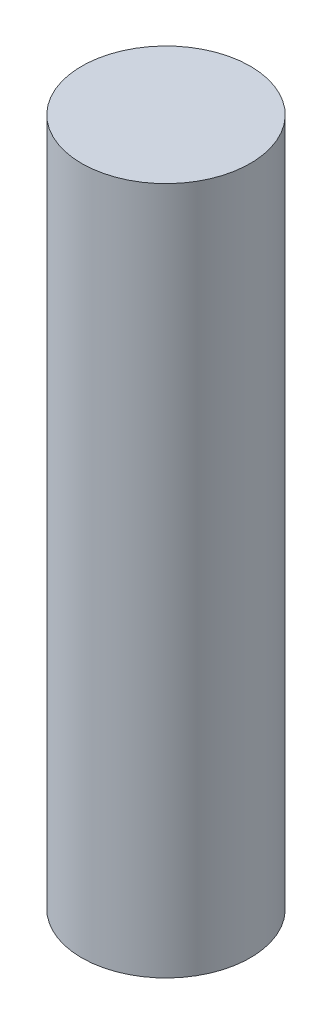
ISO-10303-21;
HEADER;
FILE_DESCRIPTION(('STEP AP214'),'2;1');
FILE_NAME('part.step','',(''),(''),'','','');
FILE_SCHEMA(('AUTOMOTIVE_DESIGN { 1 0 10303 214 1 1 1 1 }'));
ENDSEC;
DATA;
#1=APPLICATION_CONTEXT('core data for automotive mechanical design processes');
#2=APPLICATION_PROTOCOL_DEFINITION('international standard','automotive_design',2000,#1);
#3=PRODUCT_CONTEXT('',#1,'mechanical');
#4=PRODUCT('Part','Part','',(#3));
#5=PRODUCT_RELATED_PRODUCT_CATEGORY('part','',(#4));
#6=PRODUCT_DEFINITION_FORMATION('','',#4);
#7=PRODUCT_DEFINITION_CONTEXT('part definition',#1,'design');
#8=PRODUCT_DEFINITION('design','',#6,#7);
#9=PRODUCT_DEFINITION_SHAPE('','',#8);
#10=(LENGTH_UNIT() NAMED_UNIT(*) SI_UNIT(.MILLI.,.METRE.));
#11=(NAMED_UNIT(*) PLANE_ANGLE_UNIT() SI_UNIT($,.RADIAN.));
#12=(NAMED_UNIT(*) SI_UNIT($,.STERADIAN.) SOLID_ANGLE_UNIT());
#13=UNCERTAINTY_MEASURE_WITH_UNIT(LENGTH_MEASURE(1.E-05),#10,'distance_accuracy_value','');
#14=(GEOMETRIC_REPRESENTATION_CONTEXT(3) GLOBAL_UNCERTAINTY_ASSIGNED_CONTEXT((#13)) GLOBAL_UNIT_ASSIGNED_CONTEXT((#10,
#11,#12)) REPRESENTATION_CONTEXT('',''));
#15=CARTESIAN_POINT('',(0.,0.,0.));
#16=DIRECTION('',(0.,0.,1.));
#17=DIRECTION('',(1.,0.,0.));
#18=AXIS2_PLACEMENT_3D('',#15,#16,#17);
#19=CARTESIAN_POINT('',(2.54,9.144,-1.4732));
#20=DIRECTION('',(1.,0.,0.));
#21=DIRECTION('',(0.,0.,-1.));
#22=AXIS2_PLACEMENT_3D('',#19,#20,#21);
#23=PLANE('',#22);
#24=DIRECTION('',(0.,0.,-1.));
#25=VECTOR('',#24,1.);
#26=CARTESIAN_POINT('',(2.54,1.016,-1.4732));
#27=LINE('',#26,#25);
#28=CARTESIAN_POINT('',(2.54,1.016,0.813196778153969));
#29=VERTEX_POINT('',#28);
#30=CARTESIAN_POINT('',(2.54,1.016,-0.813196778153969));
#31=VERTEX_POINT('',#30);
#32=EDGE_CURVE('E303',#29,#31,#27,.T.);
#33=ORIENTED_EDGE('',*,*,#32,.F.);
#34=DIRECTION('',(0.,-1.,0.));
#35=VECTOR('',#34,1.);
#36=CARTESIAN_POINT('',(2.54,1.016,0.813196778153972));
#37=LINE('',#36,#35);
#38=CARTESIAN_POINT('',(2.54,-0.508,0.813196778153969));
#39=VERTEX_POINT('',#38);
#40=EDGE_CURVE('E212',#29,#39,#37,.T.);
#41=ORIENTED_EDGE('',*,*,#40,.T.);
#42=DIRECTION('',(0.,0.,1.));
#43=VECTOR('',#42,1.);
#44=CARTESIAN_POINT('',(2.54,-0.508,-1.4605));
#45=LINE('',#44,#43);
#46=CARTESIAN_POINT('',(2.54,-0.508,1.4605));
#47=VERTEX_POINT('',#46);
#48=EDGE_CURVE('E210',#39,#47,#45,.T.);
#49=ORIENTED_EDGE('',*,*,#48,.T.);
#50=DIRECTION('',(0.,-1.,0.));
#51=VECTOR('',#50,1.);
#52=CARTESIAN_POINT('',(2.54,1.016,1.4605));
#53=LINE('',#52,#51);
#54=CARTESIAN_POINT('',(2.54,0.,1.4605));
#55=VERTEX_POINT('',#54);
#56=EDGE_CURVE('E198',#55,#47,#53,.T.);
#57=ORIENTED_EDGE('',*,*,#56,.F.);
#58=DIRECTION('',(0.,0.,1.));
#59=VECTOR('',#58,1.);
#60=CARTESIAN_POINT('',(2.54,0.,-1.4732));
#61=LINE('',#60,#59);
#62=CARTESIAN_POINT('',(2.54,0.,1.4732));
#63=VERTEX_POINT('',#62);
#64=EDGE_CURVE('E318',#55,#63,#61,.T.);
#65=ORIENTED_EDGE('',*,*,#64,.T.);
#66=DIRECTION('',(0.,-1.,0.));
#67=VECTOR('',#66,1.);
#68=CARTESIAN_POINT('',(2.54,9.144,1.4732));
#69=LINE('',#68,#67);
#70=CARTESIAN_POINT('',(2.54,9.144,1.4732));
#71=VERTEX_POINT('',#70);
#72=EDGE_CURVE('E336',#71,#63,#69,.T.);
#73=ORIENTED_EDGE('',*,*,#72,.F.);
#74=DIRECTION('',(0.,0.,1.));
#75=VECTOR('',#74,1.);
#76=CARTESIAN_POINT('',(2.54,9.144,-1.4732));
#77=LINE('',#76,#75);
#78=CARTESIAN_POINT('',(2.54,9.144,-1.4732));
#79=VERTEX_POINT('',#78);
#80=EDGE_CURVE('E319',#79,#71,#77,.T.);
#81=ORIENTED_EDGE('',*,*,#80,.F.);
#82=DIRECTION('',(0.,-1.,0.));
#83=VECTOR('',#82,1.);
#84=CARTESIAN_POINT('',(2.54,9.144,-1.4732));
#85=LINE('',#84,#83);
#86=CARTESIAN_POINT('',(2.54,0.,-1.4732));
#87=VERTEX_POINT('',#86);
#88=EDGE_CURVE('E355',#79,#87,#85,.T.);
#89=ORIENTED_EDGE('',*,*,#88,.T.);
#90=CARTESIAN_POINT('',(2.54,0.,-1.4605));
#91=VERTEX_POINT('',#90);
#92=EDGE_CURVE('E337',#87,#91,#61,.T.);
#93=ORIENTED_EDGE('',*,*,#92,.T.);
#94=DIRECTION('',(0.,-1.,0.));
#95=VECTOR('',#94,1.);
#96=CARTESIAN_POINT('',(2.54,1.016,-1.4605));
#97=LINE('',#96,#95);
#98=CARTESIAN_POINT('',(2.54,-0.508,-1.4605));
#99=VERTEX_POINT('',#98);
#100=EDGE_CURVE('E207',#91,#99,#97,.T.);
#101=ORIENTED_EDGE('',*,*,#100,.T.);
#102=CARTESIAN_POINT('',(2.54,-0.508,-0.813196778153969));
#103=VERTEX_POINT('',#102);
#104=EDGE_CURVE('E217',#99,#103,#45,.T.);
#105=ORIENTED_EDGE('',*,*,#104,.T.);
#106=DIRECTION('',(0.,-1.,0.));
#107=VECTOR('',#106,1.);
#108=CARTESIAN_POINT('',(2.54,1.016,-0.813196778153972));
#109=LINE('',#108,#107);
#110=EDGE_CURVE('E277',#103,#31,#109,.F.);
#111=ORIENTED_EDGE('',*,*,#110,.T.);
#112=EDGE_LOOP('',(#33,#41,#49,#57,#65,#73,#81,#89,#93,#101,#105,#111));
#113=FACE_BOUND('',#112,.T.);
#114=ADVANCED_FACE('F62',(#113),#23,.F.);
#115=CARTESIAN_POINT('',(0.,0.,0.));
#116=DIRECTION('',(0.,-1.,0.));
#117=DIRECTION('',(0.,0.,-1.));
#118=AXIS2_PLACEMENT_3D('',#115,#116,#117);
#119=PLANE('',#118);
#120=CARTESIAN_POINT('',(0.,0.,0.));
#121=DIRECTION('',(0.,-1.,0.));
#122=DIRECTION('',(0.,0.,-1.));
#123=AXIS2_PLACEMENT_3D('',#120,#121,#122);
#124=CIRCLE('',#123,2.667);
#125=CARTESIAN_POINT('',(2.22318932167281,0.,-1.4732));
#126=VERTEX_POINT('',#125);
#127=CARTESIAN_POINT('',(2.23155299063231,0.,-1.4605));
#128=VERTEX_POINT('',#127);
#129=EDGE_CURVE('E389',#126,#128,#124,.T.);
#130=ORIENTED_EDGE('',*,*,#129,.T.);
#131=DIRECTION('',(1.,0.,0.));
#132=VECTOR('',#131,1.);
#133=CARTESIAN_POINT('',(0.,0.,-1.4605));
#134=LINE('',#133,#132);
#135=EDGE_CURVE('E71',#128,#91,#134,.T.);
#136=ORIENTED_EDGE('',*,*,#135,.T.);
#137=ORIENTED_EDGE('',*,*,#92,.F.);
#138=DIRECTION('',(1.,0.,0.));
#139=VECTOR('',#138,1.);
#140=CARTESIAN_POINT('',(-2.54,0.,-1.4732));
#141=LINE('',#140,#139);
#142=EDGE_CURVE('E351',#126,#87,#141,.T.);
#143=ORIENTED_EDGE('',*,*,#142,.F.);
#144=EDGE_LOOP('',(#130,#136,#137,#143));
#145=FACE_BOUND('',#144,.T.);
#146=ADVANCED_FACE('F399',(#145),#119,.F.);
#147=DIRECTION('',(1.,0.,0.));
#148=VECTOR('',#147,1.);
#149=CARTESIAN_POINT('',(0.,0.,1.4605));
#150=LINE('',#149,#148);
#151=CARTESIAN_POINT('',(2.23155299063231,0.,1.4605));
#152=VERTEX_POINT('',#151);
#153=EDGE_CURVE('E202',#152,#55,#150,.T.);
#154=ORIENTED_EDGE('',*,*,#153,.F.);
#155=CARTESIAN_POINT('',(0.,0.,0.));
#156=DIRECTION('',(0.,-1.,0.));
#157=DIRECTION('',(0.,0.,-1.));
#158=AXIS2_PLACEMENT_3D('',#155,#156,#157);
#159=CIRCLE('',#158,2.667);
#160=CARTESIAN_POINT('',(2.22318932167281,0.,1.4732));
#161=VERTEX_POINT('',#160);
#162=EDGE_CURVE('E379',#152,#161,#159,.T.);
#163=ORIENTED_EDGE('',*,*,#162,.T.);
#164=DIRECTION('',(-1.,0.,0.));
#165=VECTOR('',#164,1.);
#166=CARTESIAN_POINT('',(-2.54,0.,1.4732));
#167=LINE('',#166,#165);
#168=EDGE_CURVE('E342',#63,#161,#167,.T.);
#169=ORIENTED_EDGE('',*,*,#168,.F.);
#170=ORIENTED_EDGE('',*,*,#64,.F.);
#171=EDGE_LOOP('',(#154,#163,#169,#170));
#172=FACE_BOUND('',#171,.T.);
#173=ADVANCED_FACE('F448',(#172),#119,.F.);
#174=DIRECTION('',(1.,0.,0.));
#175=VECTOR('',#174,1.);
#176=CARTESIAN_POINT('',(0.,0.,1.4605));
#177=LINE('',#176,#175);
#178=CARTESIAN_POINT('',(-2.54,0.,1.4605));
#179=VERTEX_POINT('',#178);
#180=CARTESIAN_POINT('',(-2.23155299063231,0.,1.4605));
#181=VERTEX_POINT('',#180);
#182=EDGE_CURVE('E378',#179,#181,#177,.T.);
#183=ORIENTED_EDGE('',*,*,#182,.F.);
#184=DIRECTION('',(0.,0.,-1.));
#185=VECTOR('',#184,1.);
#186=CARTESIAN_POINT('',(-2.54,0.,-1.4732));
#187=LINE('',#186,#185);
#188=CARTESIAN_POINT('',(-2.54,0.,1.4732));
#189=VERTEX_POINT('',#188);
#190=EDGE_CURVE('E347',#189,#179,#187,.T.);
#191=ORIENTED_EDGE('',*,*,#190,.F.);
#192=CARTESIAN_POINT('',(-2.22318932167281,0.,1.4732));
#193=VERTEX_POINT('',#192);
#194=EDGE_CURVE('E341',#193,#189,#167,.T.);
#195=ORIENTED_EDGE('',*,*,#194,.F.);
#196=EDGE_CURVE('E374',#193,#181,#159,.T.);
#197=ORIENTED_EDGE('',*,*,#196,.T.);
#198=EDGE_LOOP('',(#183,#191,#195,#197));
#199=FACE_BOUND('',#198,.T.);
#200=ADVANCED_FACE('F431',(#199),#119,.F.);
#201=CARTESIAN_POINT('',(0.,9.144,0.));
#202=DIRECTION('',(0.,1.,0.));
#203=DIRECTION('',(0.,0.,1.));
#204=AXIS2_PLACEMENT_3D('',#201,#202,#203);
#205=PLANE('',#204);
#206=ORIENTED_EDGE('',*,*,#80,.T.);
#207=DIRECTION('',(-1.,0.,0.));
#208=VECTOR('',#207,1.);
#209=CARTESIAN_POINT('',(-2.54,9.144,1.4732));
#210=LINE('',#209,#208);
#211=CARTESIAN_POINT('',(-2.54,9.144,1.4732));
#212=VERTEX_POINT('',#211);
#213=EDGE_CURVE('E323',#71,#212,#210,.T.);
#214=ORIENTED_EDGE('',*,*,#213,.T.);
#215=DIRECTION('',(0.,0.,-1.));
#216=VECTOR('',#215,1.);
#217=CARTESIAN_POINT('',(-2.54,9.144,-1.4732));
#218=LINE('',#217,#216);
#219=CARTESIAN_POINT('',(-2.54,9.144,-1.4732));
#220=VERTEX_POINT('',#219);
#221=EDGE_CURVE('E328',#212,#220,#218,.T.);
#222=ORIENTED_EDGE('',*,*,#221,.T.);
#223=DIRECTION('',(1.,0.,0.));
#224=VECTOR('',#223,1.);
#225=CARTESIAN_POINT('',(-2.54,9.144,-1.4732));
#226=LINE('',#225,#224);
#227=EDGE_CURVE('E332',#220,#79,#226,.T.);
#228=ORIENTED_EDGE('',*,*,#227,.T.);
#229=EDGE_LOOP('',(#206,#214,#222,#228));
#230=FACE_BOUND('',#229,.T.);
#231=ADVANCED_FACE('F419',(#230),#205,.F.);
#232=CARTESIAN_POINT('',(-2.54,9.144,-1.4732));
#233=DIRECTION('',(-1.,0.,0.));
#234=DIRECTION('',(0.,0.,1.));
#235=AXIS2_PLACEMENT_3D('',#232,#233,#234);
#236=PLANE('',#235);
#237=DIRECTION('',(0.,-1.,0.));
#238=VECTOR('',#237,1.);
#239=CARTESIAN_POINT('',(-2.54,1.016,-1.4605));
#240=LINE('',#239,#238);
#241=CARTESIAN_POINT('',(-2.54,0.,-1.4605));
#242=VERTEX_POINT('',#241);
#243=CARTESIAN_POINT('',(-2.54,-0.508,-1.4605));
#244=VERTEX_POINT('',#243);
#245=EDGE_CURVE('E252',#242,#244,#240,.T.);
#246=ORIENTED_EDGE('',*,*,#245,.F.);
#247=CARTESIAN_POINT('',(-2.54,0.,-1.4732));
#248=VERTEX_POINT('',#247);
#249=EDGE_CURVE('E346',#242,#248,#187,.T.);
#250=ORIENTED_EDGE('',*,*,#249,.T.);
#251=DIRECTION('',(0.,-1.,0.));
#252=VECTOR('',#251,1.);
#253=CARTESIAN_POINT('',(-2.54,9.144,-1.4732));
#254=LINE('',#253,#252);
#255=EDGE_CURVE('E360',#220,#248,#254,.T.);
#256=ORIENTED_EDGE('',*,*,#255,.F.);
#257=ORIENTED_EDGE('',*,*,#221,.F.);
#258=DIRECTION('',(0.,-1.,0.));
#259=VECTOR('',#258,1.);
#260=CARTESIAN_POINT('',(-2.54,9.144,1.4732));
#261=LINE('',#260,#259);
#262=EDGE_CURVE('E364',#212,#189,#261,.T.);
#263=ORIENTED_EDGE('',*,*,#262,.T.);
#264=ORIENTED_EDGE('',*,*,#190,.T.);
#265=DIRECTION('',(0.,-1.,0.));
#266=VECTOR('',#265,1.);
#267=CARTESIAN_POINT('',(-2.54,1.016,1.4605));
#268=LINE('',#267,#266);
#269=CARTESIAN_POINT('',(-2.54,-0.508,1.4605));
#270=VERTEX_POINT('',#269);
#271=EDGE_CURVE('E249',#179,#270,#268,.T.);
#272=ORIENTED_EDGE('',*,*,#271,.T.);
#273=DIRECTION('',(0.,0.,1.));
#274=VECTOR('',#273,1.);
#275=CARTESIAN_POINT('',(-2.54,-0.508,-1.4605));
#276=LINE('',#275,#274);
#277=CARTESIAN_POINT('',(-2.54,-0.508,0.813196778153972));
#278=VERTEX_POINT('',#277);
#279=EDGE_CURVE('E244',#278,#270,#276,.T.);
#280=ORIENTED_EDGE('',*,*,#279,.F.);
#281=DIRECTION('',(0.,-1.,0.));
#282=VECTOR('',#281,1.);
#283=CARTESIAN_POINT('',(-2.54,1.016,0.813196778153974));
#284=LINE('',#283,#282);
#285=CARTESIAN_POINT('',(-2.54,1.016,0.813196778153972));
#286=VERTEX_POINT('',#285);
#287=EDGE_CURVE('E267',#286,#278,#284,.T.);
#288=ORIENTED_EDGE('',*,*,#287,.F.);
#289=DIRECTION('',(0.,0.,1.));
#290=VECTOR('',#289,1.);
#291=CARTESIAN_POINT('',(-2.54,1.016,-1.4732));
#292=LINE('',#291,#290);
#293=CARTESIAN_POINT('',(-2.54,1.016,-0.813196778153972));
#294=VERTEX_POINT('',#293);
#295=EDGE_CURVE('E310',#294,#286,#292,.T.);
#296=ORIENTED_EDGE('',*,*,#295,.F.);
#297=DIRECTION('',(0.,-1.,0.));
#298=VECTOR('',#297,1.);
#299=CARTESIAN_POINT('',(-2.54,1.016,-0.813196778153974));
#300=LINE('',#299,#298);
#301=CARTESIAN_POINT('',(-2.54,-0.508,-0.813196778153972));
#302=VERTEX_POINT('',#301);
#303=EDGE_CURVE('E206',#302,#294,#300,.F.);
#304=ORIENTED_EDGE('',*,*,#303,.F.);
#305=EDGE_CURVE('E245',#244,#302,#276,.T.);
#306=ORIENTED_EDGE('',*,*,#305,.F.);
#307=EDGE_LOOP('',(#246,#250,#256,#257,#263,#264,#272,#280,#288,#296,#304,#306));
#308=FACE_BOUND('',#307,.T.);
#309=ADVANCED_FACE('F417',(#308),#236,.F.);
#310=CARTESIAN_POINT('',(-2.54,9.144,-1.4732));
#311=DIRECTION('',(0.,0.,-1.));
#312=DIRECTION('',(-1.,0.,0.));
#313=AXIS2_PLACEMENT_3D('',#310,#311,#312);
#314=PLANE('',#313);
#315=DIRECTION('',(-1.,0.,0.));
#316=VECTOR('',#315,1.);
#317=CARTESIAN_POINT('',(-2.54,1.016,-1.4732));
#318=LINE('',#317,#316);
#319=CARTESIAN_POINT('',(2.22318932167281,1.016,-1.4732));
#320=VERTEX_POINT('',#319);
#321=CARTESIAN_POINT('',(-2.22318932167281,1.016,-1.4732));
#322=VERTEX_POINT('',#321);
#323=EDGE_CURVE('E307',#320,#322,#318,.T.);
#324=ORIENTED_EDGE('',*,*,#323,.F.);
#325=DIRECTION('',(0.,-1.,0.));
#326=VECTOR('',#325,1.);
#327=CARTESIAN_POINT('',(2.22318932167281,1.016,-1.4732));
#328=LINE('',#327,#326);
#329=EDGE_CURVE('E299',#320,#126,#328,.T.);
#330=ORIENTED_EDGE('',*,*,#329,.T.);
#331=ORIENTED_EDGE('',*,*,#142,.T.);
#332=ORIENTED_EDGE('',*,*,#88,.F.);
#333=ORIENTED_EDGE('',*,*,#227,.F.);
#334=ORIENTED_EDGE('',*,*,#255,.T.);
#335=CARTESIAN_POINT('',(-2.22318932167281,0.,-1.4732));
#336=VERTEX_POINT('',#335);
#337=EDGE_CURVE('E324',#248,#336,#141,.T.);
#338=ORIENTED_EDGE('',*,*,#337,.T.);
#339=DIRECTION('',(0.,-1.,0.));
#340=VECTOR('',#339,1.);
#341=CARTESIAN_POINT('',(-2.22318932167281,1.016,-1.4732));
#342=LINE('',#341,#340);
#343=EDGE_CURVE('E295',#336,#322,#342,.F.);
#344=ORIENTED_EDGE('',*,*,#343,.T.);
#345=EDGE_LOOP('',(#324,#330,#331,#332,#333,#334,#338,#344));
#346=FACE_BOUND('',#345,.T.);
#347=ADVANCED_FACE('F406',(#346),#314,.F.);
#348=CARTESIAN_POINT('',(-2.54,9.144,1.4732));
#349=DIRECTION('',(0.,0.,1.));
#350=DIRECTION('',(1.,0.,0.));
#351=AXIS2_PLACEMENT_3D('',#348,#349,#350);
#352=PLANE('',#351);
#353=DIRECTION('',(1.,0.,0.));
#354=VECTOR('',#353,1.);
#355=CARTESIAN_POINT('',(-2.54,1.016,1.4732));
#356=LINE('',#355,#354);
#357=CARTESIAN_POINT('',(-2.22318932167281,1.016,1.4732));
#358=VERTEX_POINT('',#357);
#359=CARTESIAN_POINT('',(2.22318932167281,1.016,1.4732));
#360=VERTEX_POINT('',#359);
#361=EDGE_CURVE('E12',#358,#360,#356,.T.);
#362=ORIENTED_EDGE('',*,*,#361,.F.);
#363=DIRECTION('',(0.,-1.,0.));
#364=VECTOR('',#363,1.);
#365=CARTESIAN_POINT('',(-2.22318932167281,1.016,1.4732));
#366=LINE('',#365,#364);
#367=EDGE_CURVE('E287',#358,#193,#366,.T.);
#368=ORIENTED_EDGE('',*,*,#367,.T.);
#369=ORIENTED_EDGE('',*,*,#194,.T.);
#370=ORIENTED_EDGE('',*,*,#262,.F.);
#371=ORIENTED_EDGE('',*,*,#213,.F.);
#372=ORIENTED_EDGE('',*,*,#72,.T.);
#373=ORIENTED_EDGE('',*,*,#168,.T.);
#374=DIRECTION('',(0.,-1.,0.));
#375=VECTOR('',#374,1.);
#376=CARTESIAN_POINT('',(2.22318932167281,1.016,1.4732));
#377=LINE('',#376,#375);
#378=EDGE_CURVE('E291',#161,#360,#377,.F.);
#379=ORIENTED_EDGE('',*,*,#378,.T.);
#380=EDGE_LOOP('',(#362,#368,#369,#370,#371,#372,#373,#379));
#381=FACE_BOUND('',#380,.T.);
#382=ADVANCED_FACE('F424',(#381),#352,.F.);
#383=ORIENTED_EDGE('',*,*,#249,.F.);
#384=DIRECTION('',(1.,0.,0.));
#385=VECTOR('',#384,1.);
#386=CARTESIAN_POINT('',(0.,0.,-1.4605));
#387=LINE('',#386,#385);
#388=CARTESIAN_POINT('',(-2.23155299063231,0.,-1.4605));
#389=VERTEX_POINT('',#388);
#390=EDGE_CURVE('E388',#242,#389,#387,.T.);
#391=ORIENTED_EDGE('',*,*,#390,.T.);
#392=EDGE_CURVE('E384',#389,#336,#124,.T.);
#393=ORIENTED_EDGE('',*,*,#392,.T.);
#394=ORIENTED_EDGE('',*,*,#337,.F.);
#395=EDGE_LOOP('',(#383,#391,#393,#394));
#396=FACE_BOUND('',#395,.T.);
#397=ADVANCED_FACE('F412',(#396),#119,.F.);
#398=CARTESIAN_POINT('',(0.,1.016,0.));
#399=DIRECTION('',(0.,-1.,0.));
#400=DIRECTION('',(0.,0.,-1.));
#401=AXIS2_PLACEMENT_3D('',#398,#399,#400);
#402=PLANE('',#401);
#403=ORIENTED_EDGE('',*,*,#295,.T.);
#404=CARTESIAN_POINT('',(0.,1.016,0.));
#405=DIRECTION('',(0.,-1.,0.));
#406=DIRECTION('',(0.,0.,-1.));
#407=AXIS2_PLACEMENT_3D('',#404,#405,#406);
#408=CIRCLE('',#407,2.667);
#409=EDGE_CURVE('E235',#286,#294,#408,.T.);
#410=ORIENTED_EDGE('',*,*,#409,.T.);
#411=EDGE_LOOP('',(#403,#410));
#412=FACE_BOUND('',#411,.T.);
#413=ADVANCED_FACE('F459',(#412),#402,.T.);
#414=ORIENTED_EDGE('',*,*,#323,.T.);
#415=EDGE_CURVE('E234',#322,#320,#408,.T.);
#416=ORIENTED_EDGE('',*,*,#415,.T.);
#417=EDGE_LOOP('',(#414,#416));
#418=FACE_BOUND('',#417,.T.);
#419=ADVANCED_FACE('F408',(#418),#402,.T.);
#420=ORIENTED_EDGE('',*,*,#32,.T.);
#421=EDGE_CURVE('E227',#31,#29,#408,.T.);
#422=ORIENTED_EDGE('',*,*,#421,.T.);
#423=EDGE_LOOP('',(#420,#422));
#424=FACE_BOUND('',#423,.T.);
#425=ADVANCED_FACE('F479',(#424),#402,.T.);
#426=ORIENTED_EDGE('',*,*,#361,.T.);
#427=EDGE_CURVE('E232',#360,#358,#408,.T.);
#428=ORIENTED_EDGE('',*,*,#427,.T.);
#429=EDGE_LOOP('',(#426,#428));
#430=FACE_BOUND('',#429,.T.);
#431=ADVANCED_FACE('F472',(#430),#402,.T.);
#432=CARTESIAN_POINT('',(-2.54,1.016,-1.4605));
#433=DIRECTION('',(0.,0.,-1.));
#434=DIRECTION('',(-1.,0.,0.));
#435=AXIS2_PLACEMENT_3D('',#432,#433,#434);
#436=PLANE('',#435);
#437=ORIENTED_EDGE('',*,*,#245,.T.);
#438=DIRECTION('',(1.,0.,0.));
#439=VECTOR('',#438,1.);
#440=CARTESIAN_POINT('',(-2.54,-0.508,-1.4605));
#441=LINE('',#440,#439);
#442=CARTESIAN_POINT('',(-2.23155299063231,-0.508,-1.4605));
#443=VERTEX_POINT('',#442);
#444=EDGE_CURVE('E240',#244,#443,#441,.T.);
#445=ORIENTED_EDGE('',*,*,#444,.T.);
#446=DIRECTION('',(0.,-1.,0.));
#447=VECTOR('',#446,1.);
#448=CARTESIAN_POINT('',(-2.23155299063231,1.016,-1.4605));
#449=LINE('',#448,#447);
#450=EDGE_CURVE('E270',#443,#389,#449,.F.);
#451=ORIENTED_EDGE('',*,*,#450,.T.);
#452=ORIENTED_EDGE('',*,*,#390,.F.);
#453=EDGE_LOOP('',(#437,#445,#451,#452));
#454=FACE_BOUND('',#453,.T.);
#455=ADVANCED_FACE('F470',(#454),#436,.F.);
#456=CARTESIAN_POINT('',(-2.54,1.016,1.4605));
#457=DIRECTION('',(0.,0.,-1.));
#458=DIRECTION('',(-1.,0.,0.));
#459=AXIS2_PLACEMENT_3D('',#456,#457,#458);
#460=PLANE('',#459);
#461=ORIENTED_EDGE('',*,*,#182,.T.);
#462=DIRECTION('',(0.,-1.,0.));
#463=VECTOR('',#462,1.);
#464=CARTESIAN_POINT('',(-2.23155299063231,1.016,1.4605));
#465=LINE('',#464,#463);
#466=CARTESIAN_POINT('',(-2.23155299063231,-0.508,1.4605));
#467=VERTEX_POINT('',#466);
#468=EDGE_CURVE('E86',#467,#181,#465,.F.);
#469=ORIENTED_EDGE('',*,*,#468,.F.);
#470=DIRECTION('',(1.,0.,0.));
#471=VECTOR('',#470,1.);
#472=CARTESIAN_POINT('',(-2.54,-0.508,1.4605));
#473=LINE('',#472,#471);
#474=EDGE_CURVE('E218',#270,#467,#473,.T.);
#475=ORIENTED_EDGE('',*,*,#474,.F.);
#476=ORIENTED_EDGE('',*,*,#271,.F.);
#477=EDGE_LOOP('',(#461,#469,#475,#476));
#478=FACE_BOUND('',#477,.T.);
#479=ADVANCED_FACE('F433',(#478),#460,.T.);
#480=ORIENTED_EDGE('',*,*,#153,.T.);
#481=ORIENTED_EDGE('',*,*,#56,.T.);
#482=CARTESIAN_POINT('',(2.23155299063231,-0.508,1.4605));
#483=VERTEX_POINT('',#482);
#484=EDGE_CURVE('E78',#483,#47,#473,.T.);
#485=ORIENTED_EDGE('',*,*,#484,.F.);
#486=DIRECTION('',(0.,-1.,0.));
#487=VECTOR('',#486,1.);
#488=CARTESIAN_POINT('',(2.23155299063231,1.016,1.4605));
#489=LINE('',#488,#487);
#490=EDGE_CURVE('E284',#152,#483,#489,.T.);
#491=ORIENTED_EDGE('',*,*,#490,.F.);
#492=EDGE_LOOP('',(#480,#481,#485,#491));
#493=FACE_BOUND('',#492,.T.);
#494=ADVANCED_FACE('F200',(#493),#460,.T.);
#495=DIRECTION('',(0.,-1.,0.));
#496=VECTOR('',#495,1.);
#497=CARTESIAN_POINT('',(2.23155299063231,1.016,-1.4605));
#498=LINE('',#497,#496);
#499=CARTESIAN_POINT('',(2.23155299063231,-0.508,-1.4605));
#500=VERTEX_POINT('',#499);
#501=EDGE_CURVE('E274',#128,#500,#498,.T.);
#502=ORIENTED_EDGE('',*,*,#501,.T.);
#503=EDGE_CURVE('E239',#500,#99,#441,.T.);
#504=ORIENTED_EDGE('',*,*,#503,.T.);
#505=ORIENTED_EDGE('',*,*,#100,.F.);
#506=ORIENTED_EDGE('',*,*,#135,.F.);
#507=EDGE_LOOP('',(#502,#504,#505,#506));
#508=FACE_BOUND('',#507,.T.);
#509=ADVANCED_FACE('F442',(#508),#436,.F.);
#510=CARTESIAN_POINT('',(0.,1.016,0.));
#511=DIRECTION('',(0.,-1.,0.));
#512=DIRECTION('',(0.,0.,-1.));
#513=AXIS2_PLACEMENT_3D('',#510,#511,#512);
#514=CYLINDRICAL_SURFACE('',#513,2.667);
#515=ORIENTED_EDGE('',*,*,#415,.F.);
#516=ORIENTED_EDGE('',*,*,#343,.F.);
#517=ORIENTED_EDGE('',*,*,#392,.F.);
#518=ORIENTED_EDGE('',*,*,#450,.F.);
#519=CARTESIAN_POINT('',(0.,-0.508,0.));
#520=DIRECTION('',(0.,-1.,0.));
#521=DIRECTION('',(0.,0.,-1.));
#522=AXIS2_PLACEMENT_3D('',#519,#520,#521);
#523=CIRCLE('',#522,2.667);
#524=EDGE_CURVE('E260',#443,#500,#523,.T.);
#525=ORIENTED_EDGE('',*,*,#524,.T.);
#526=ORIENTED_EDGE('',*,*,#501,.F.);
#527=ORIENTED_EDGE('',*,*,#129,.F.);
#528=ORIENTED_EDGE('',*,*,#329,.F.);
#529=EDGE_LOOP('',(#515,#516,#517,#518,#525,#526,#527,#528));
#530=FACE_BOUND('',#529,.T.);
#531=ADVANCED_FACE('F403',(#530),#514,.F.);
#532=ORIENTED_EDGE('',*,*,#162,.F.);
#533=ORIENTED_EDGE('',*,*,#490,.T.);
#534=EDGE_CURVE('E225',#483,#467,#523,.T.);
#535=ORIENTED_EDGE('',*,*,#534,.T.);
#536=ORIENTED_EDGE('',*,*,#468,.T.);
#537=ORIENTED_EDGE('',*,*,#196,.F.);
#538=ORIENTED_EDGE('',*,*,#367,.F.);
#539=ORIENTED_EDGE('',*,*,#427,.F.);
#540=ORIENTED_EDGE('',*,*,#378,.F.);
#541=EDGE_LOOP('',(#532,#533,#535,#536,#537,#538,#539,#540));
#542=FACE_BOUND('',#541,.T.);
#543=ADVANCED_FACE('F450',(#542),#514,.F.);
#544=ORIENTED_EDGE('',*,*,#409,.F.);
#545=ORIENTED_EDGE('',*,*,#287,.T.);
#546=EDGE_CURVE('E264',#278,#302,#523,.T.);
#547=ORIENTED_EDGE('',*,*,#546,.T.);
#548=ORIENTED_EDGE('',*,*,#303,.T.);
#549=EDGE_LOOP('',(#544,#545,#547,#548));
#550=FACE_BOUND('',#549,.T.);
#551=ADVANCED_FACE('F462',(#550),#514,.F.);
#552=ORIENTED_EDGE('',*,*,#421,.F.);
#553=ORIENTED_EDGE('',*,*,#110,.F.);
#554=EDGE_CURVE('E259',#103,#39,#523,.T.);
#555=ORIENTED_EDGE('',*,*,#554,.T.);
#556=ORIENTED_EDGE('',*,*,#40,.F.);
#557=EDGE_LOOP('',(#552,#553,#555,#556));
#558=FACE_BOUND('',#557,.T.);
#559=ADVANCED_FACE('F499',(#558),#514,.F.);
#560=CARTESIAN_POINT('',(0.,25.4,0.));
#561=DIRECTION('',(0.,-1.,0.));
#562=DIRECTION('',(0.,0.,-1.));
#563=AXIS2_PLACEMENT_3D('',#560,#561,#562);
#564=CYLINDRICAL_SURFACE('',#563,3.175);
#565=CARTESIAN_POINT('',(0.,25.4,0.));
#566=DIRECTION('',(0.,1.,0.));
#567=DIRECTION('',(0.,0.,1.));
#568=AXIS2_PLACEMENT_3D('',#565,#566,#567);
#569=CIRCLE('',#568,3.175);
#570=CARTESIAN_POINT('',(0.,25.4,3.175));
#571=VERTEX_POINT('',#570);
#572=EDGE_CURVE('E359',#571,#571,#569,.T.);
#573=ORIENTED_EDGE('',*,*,#572,.F.);
#574=EDGE_LOOP('',(#573));
#575=FACE_BOUND('',#574,.T.);
#576=CARTESIAN_POINT('',(0.,-0.508,0.));
#577=DIRECTION('',(0.,-1.,0.));
#578=DIRECTION('',(0.,0.,-1.));
#579=AXIS2_PLACEMENT_3D('',#576,#577,#578);
#580=CIRCLE('',#579,3.175);
#581=CARTESIAN_POINT('',(0.,-0.508,-3.175));
#582=VERTEX_POINT('',#581);
#583=EDGE_CURVE('E314',#582,#582,#580,.T.);
#584=ORIENTED_EDGE('',*,*,#583,.F.);
#585=EDGE_LOOP('',(#584));
#586=FACE_BOUND('',#585,.T.);
#587=ADVANCED_FACE('F64',(#575,#586),#564,.T.);
#588=CARTESIAN_POINT('',(0.,25.4,0.));
#589=DIRECTION('',(0.,1.,0.));
#590=DIRECTION('',(0.,0.,1.));
#591=AXIS2_PLACEMENT_3D('',#588,#589,#590);
#592=PLANE('',#591);
#593=ORIENTED_EDGE('',*,*,#572,.T.);
#594=EDGE_LOOP('',(#593));
#595=FACE_BOUND('',#594,.T.);
#596=ADVANCED_FACE('F491',(#595),#592,.T.);
#597=CARTESIAN_POINT('',(0.,-0.508,0.));
#598=DIRECTION('',(0.,-1.,0.));
#599=DIRECTION('',(0.,0.,-1.));
#600=AXIS2_PLACEMENT_3D('',#597,#598,#599);
#601=PLANE('',#600);
#602=ORIENTED_EDGE('',*,*,#104,.F.);
#603=ORIENTED_EDGE('',*,*,#503,.F.);
#604=ORIENTED_EDGE('',*,*,#524,.F.);
#605=ORIENTED_EDGE('',*,*,#444,.F.);
#606=ORIENTED_EDGE('',*,*,#305,.T.);
#607=ORIENTED_EDGE('',*,*,#546,.F.);
#608=ORIENTED_EDGE('',*,*,#279,.T.);
#609=ORIENTED_EDGE('',*,*,#474,.T.);
#610=ORIENTED_EDGE('',*,*,#534,.F.);
#611=ORIENTED_EDGE('',*,*,#484,.T.);
#612=ORIENTED_EDGE('',*,*,#48,.F.);
#613=ORIENTED_EDGE('',*,*,#554,.F.);
#614=EDGE_LOOP('',(#602,#603,#604,#605,#606,#607,#608,#609,#610,#611,#612,#613));
#615=FACE_BOUND('',#614,.T.);
#616=ORIENTED_EDGE('',*,*,#583,.T.);
#617=EDGE_LOOP('',(#616));
#618=FACE_BOUND('',#617,.T.);
#619=ADVANCED_FACE('F222',(#615,#618),#601,.T.);
#620=CLOSED_SHELL('',(#114,#146,#173,#200,#231,#309,#347,#382,#397,#413,#419,#425,#431,#455,
#479,#494,#509,#531,#543,#551,#559,#587,#596,#619));
#621=MANIFOLD_SOLID_BREP('B2',#620);
#622=ADVANCED_BREP_SHAPE_REPRESENTATION('',(#18,#621),#14);
#623=SHAPE_DEFINITION_REPRESENTATION(#9,#622);
ENDSEC;
END-ISO-10303-21;
